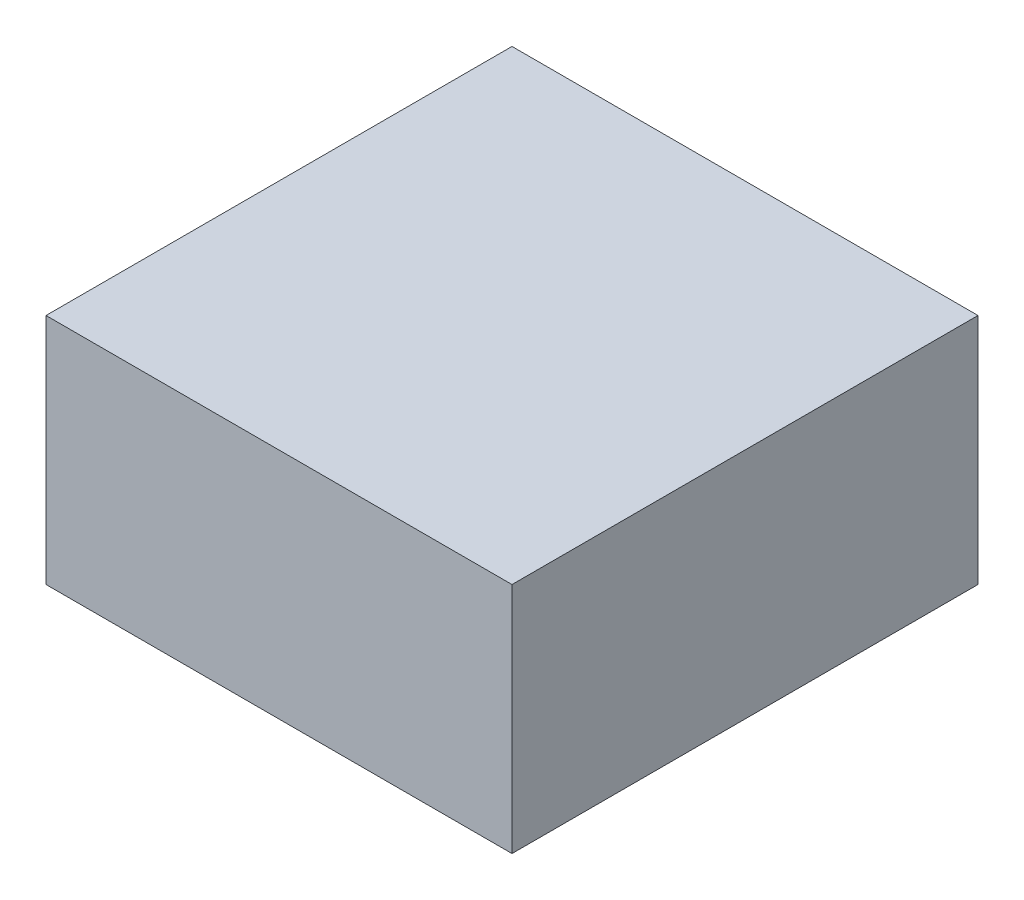
ISO-10303-21;
HEADER;
FILE_DESCRIPTION(('STEP AP214'),'2;1');
FILE_NAME('part.step','',(''),(''),'','','');
FILE_SCHEMA(('AUTOMOTIVE_DESIGN { 1 0 10303 214 1 1 1 1 }'));
ENDSEC;
DATA;
#1=APPLICATION_CONTEXT('core data for automotive mechanical design processes');
#2=APPLICATION_PROTOCOL_DEFINITION('international standard','automotive_design',2000,#1);
#3=PRODUCT_CONTEXT('',#1,'mechanical');
#4=PRODUCT('Part','Part','',(#3));
#5=PRODUCT_RELATED_PRODUCT_CATEGORY('part','',(#4));
#6=PRODUCT_DEFINITION_FORMATION('','',#4);
#7=PRODUCT_DEFINITION_CONTEXT('part definition',#1,'design');
#8=PRODUCT_DEFINITION('design','',#6,#7);
#9=PRODUCT_DEFINITION_SHAPE('','',#8);
#10=(LENGTH_UNIT() NAMED_UNIT(*) SI_UNIT(.MILLI.,.METRE.));
#11=(NAMED_UNIT(*) PLANE_ANGLE_UNIT() SI_UNIT($,.RADIAN.));
#12=(NAMED_UNIT(*) SI_UNIT($,.STERADIAN.) SOLID_ANGLE_UNIT());
#13=UNCERTAINTY_MEASURE_WITH_UNIT(LENGTH_MEASURE(1.E-05),#10,'distance_accuracy_value','');
#14=(GEOMETRIC_REPRESENTATION_CONTEXT(3) GLOBAL_UNCERTAINTY_ASSIGNED_CONTEXT((#13)) GLOBAL_UNIT_ASSIGNED_CONTEXT((#10,
#11,#12)) REPRESENTATION_CONTEXT('',''));
#15=CARTESIAN_POINT('',(0.,0.,0.));
#16=DIRECTION('',(0.,0.,1.));
#17=DIRECTION('',(1.,0.,0.));
#18=AXIS2_PLACEMENT_3D('',#15,#16,#17);
#19=CARTESIAN_POINT('',(1500.,750.,1500.));
#20=DIRECTION('',(-1.,0.,0.));
#21=DIRECTION('',(0.,0.,1.));
#22=AXIS2_PLACEMENT_3D('',#19,#20,#21);
#23=PLANE('',#22);
#24=DIRECTION('',(0.,0.,-1.));
#25=VECTOR('',#24,1.);
#26=CARTESIAN_POINT('',(1500.,-750.,1500.));
#27=LINE('',#26,#25);
#28=CARTESIAN_POINT('',(1500.,-750.,1500.));
#29=VERTEX_POINT('',#28);
#30=CARTESIAN_POINT('',(1500.,-750.,-1500.));
#31=VERTEX_POINT('',#30);
#32=EDGE_CURVE('E107',#29,#31,#27,.T.);
#33=ORIENTED_EDGE('',*,*,#32,.T.);
#34=DIRECTION('',(0.,-1.,0.));
#35=VECTOR('',#34,1.);
#36=CARTESIAN_POINT('',(1500.,750.,-1500.));
#37=LINE('',#36,#35);
#38=CARTESIAN_POINT('',(1500.,750.,-1500.));
#39=VERTEX_POINT('',#38);
#40=EDGE_CURVE('E11',#39,#31,#37,.T.);
#41=ORIENTED_EDGE('',*,*,#40,.F.);
#42=DIRECTION('',(0.,0.,-1.));
#43=VECTOR('',#42,1.);
#44=CARTESIAN_POINT('',(1500.,750.,1500.));
#45=LINE('',#44,#43);
#46=CARTESIAN_POINT('',(1500.,750.,1500.));
#47=VERTEX_POINT('',#46);
#48=EDGE_CURVE('E91',#47,#39,#45,.T.);
#49=ORIENTED_EDGE('',*,*,#48,.F.);
#50=DIRECTION('',(0.,-1.,0.));
#51=VECTOR('',#50,1.);
#52=CARTESIAN_POINT('',(1500.,750.,1500.));
#53=LINE('',#52,#51);
#54=EDGE_CURVE('E103',#47,#29,#53,.T.);
#55=ORIENTED_EDGE('',*,*,#54,.T.);
#56=EDGE_LOOP('',(#33,#41,#49,#55));
#57=FACE_BOUND('',#56,.T.);
#58=ADVANCED_FACE('F39',(#57),#23,.F.);
#59=CARTESIAN_POINT('',(-1500.,750.,-1500.));
#60=DIRECTION('',(0.,0.,1.));
#61=DIRECTION('',(1.,0.,0.));
#62=AXIS2_PLACEMENT_3D('',#59,#60,#61);
#63=PLANE('',#62);
#64=DIRECTION('',(-1.,0.,0.));
#65=VECTOR('',#64,1.);
#66=CARTESIAN_POINT('',(-1500.,-750.,-1500.));
#67=LINE('',#66,#65);
#68=CARTESIAN_POINT('',(-1500.,-750.,-1500.));
#69=VERTEX_POINT('',#68);
#70=EDGE_CURVE('E96',#31,#69,#67,.T.);
#71=ORIENTED_EDGE('',*,*,#70,.T.);
#72=DIRECTION('',(0.,-1.,0.));
#73=VECTOR('',#72,1.);
#74=CARTESIAN_POINT('',(-1500.,750.,-1500.));
#75=LINE('',#74,#73);
#76=CARTESIAN_POINT('',(-1500.,750.,-1500.));
#77=VERTEX_POINT('',#76);
#78=EDGE_CURVE('E48',#77,#69,#75,.T.);
#79=ORIENTED_EDGE('',*,*,#78,.F.);
#80=DIRECTION('',(-1.,0.,0.));
#81=VECTOR('',#80,1.);
#82=CARTESIAN_POINT('',(-1500.,750.,-1500.));
#83=LINE('',#82,#81);
#84=EDGE_CURVE('E86',#39,#77,#83,.T.);
#85=ORIENTED_EDGE('',*,*,#84,.F.);
#86=ORIENTED_EDGE('',*,*,#40,.T.);
#87=EDGE_LOOP('',(#71,#79,#85,#86));
#88=FACE_BOUND('',#87,.T.);
#89=ADVANCED_FACE('F95',(#88),#63,.F.);
#90=CARTESIAN_POINT('',(-1500.,750.,1500.));
#91=DIRECTION('',(1.,0.,0.));
#92=DIRECTION('',(0.,0.,-1.));
#93=AXIS2_PLACEMENT_3D('',#90,#91,#92);
#94=PLANE('',#93);
#95=DIRECTION('',(0.,0.,1.));
#96=VECTOR('',#95,1.);
#97=CARTESIAN_POINT('',(-1500.,-750.,1500.));
#98=LINE('',#97,#96);
#99=CARTESIAN_POINT('',(-1500.,-750.,1500.));
#100=VERTEX_POINT('',#99);
#101=EDGE_CURVE('E73',#69,#100,#98,.T.);
#102=ORIENTED_EDGE('',*,*,#101,.T.);
#103=DIRECTION('',(0.,-1.,0.));
#104=VECTOR('',#103,1.);
#105=CARTESIAN_POINT('',(-1500.,750.,1500.));
#106=LINE('',#105,#104);
#107=CARTESIAN_POINT('',(-1500.,750.,1500.));
#108=VERTEX_POINT('',#107);
#109=EDGE_CURVE('E98',#108,#100,#106,.T.);
#110=ORIENTED_EDGE('',*,*,#109,.F.);
#111=DIRECTION('',(0.,0.,1.));
#112=VECTOR('',#111,1.);
#113=CARTESIAN_POINT('',(-1500.,750.,1500.));
#114=LINE('',#113,#112);
#115=EDGE_CURVE('E89',#77,#108,#114,.T.);
#116=ORIENTED_EDGE('',*,*,#115,.F.);
#117=ORIENTED_EDGE('',*,*,#78,.T.);
#118=EDGE_LOOP('',(#102,#110,#116,#117));
#119=FACE_BOUND('',#118,.T.);
#120=ADVANCED_FACE('F99',(#119),#94,.F.);
#121=CARTESIAN_POINT('',(-1500.,750.,1500.));
#122=DIRECTION('',(0.,0.,-1.));
#123=DIRECTION('',(-1.,0.,0.));
#124=AXIS2_PLACEMENT_3D('',#121,#122,#123);
#125=PLANE('',#124);
#126=DIRECTION('',(1.,0.,0.));
#127=VECTOR('',#126,1.);
#128=CARTESIAN_POINT('',(-1500.,-750.,1500.));
#129=LINE('',#128,#127);
#130=EDGE_CURVE('E79',#100,#29,#129,.T.);
#131=ORIENTED_EDGE('',*,*,#130,.T.);
#132=ORIENTED_EDGE('',*,*,#54,.F.);
#133=DIRECTION('',(1.,0.,0.));
#134=VECTOR('',#133,1.);
#135=CARTESIAN_POINT('',(-1500.,750.,1500.));
#136=LINE('',#135,#134);
#137=EDGE_CURVE('E56',#108,#47,#136,.T.);
#138=ORIENTED_EDGE('',*,*,#137,.F.);
#139=ORIENTED_EDGE('',*,*,#109,.T.);
#140=EDGE_LOOP('',(#131,#132,#138,#139));
#141=FACE_BOUND('',#140,.T.);
#142=ADVANCED_FACE('F120',(#141),#125,.F.);
#143=CARTESIAN_POINT('',(0.,750.,0.));
#144=DIRECTION('',(0.,-1.,0.));
#145=DIRECTION('',(0.,0.,-1.));
#146=AXIS2_PLACEMENT_3D('',#143,#144,#145);
#147=PLANE('',#146);
#148=ORIENTED_EDGE('',*,*,#48,.T.);
#149=ORIENTED_EDGE('',*,*,#84,.T.);
#150=ORIENTED_EDGE('',*,*,#115,.T.);
#151=ORIENTED_EDGE('',*,*,#137,.T.);
#152=EDGE_LOOP('',(#148,#149,#150,#151));
#153=FACE_BOUND('',#152,.T.);
#154=ADVANCED_FACE('F87',(#153),#147,.F.);
#155=CARTESIAN_POINT('',(0.,-750.,0.));
#156=DIRECTION('',(0.,-1.,0.));
#157=DIRECTION('',(0.,0.,-1.));
#158=AXIS2_PLACEMENT_3D('',#155,#156,#157);
#159=PLANE('',#158);
#160=ORIENTED_EDGE('',*,*,#32,.F.);
#161=ORIENTED_EDGE('',*,*,#130,.F.);
#162=ORIENTED_EDGE('',*,*,#101,.F.);
#163=ORIENTED_EDGE('',*,*,#70,.F.);
#164=EDGE_LOOP('',(#160,#161,#162,#163));
#165=FACE_BOUND('',#164,.T.);
#166=ADVANCED_FACE('F123',(#165),#159,.T.);
#167=CLOSED_SHELL('',(#58,#89,#120,#142,#154,#166));
#168=MANIFOLD_SOLID_BREP('B2',#167);
#169=ADVANCED_BREP_SHAPE_REPRESENTATION('',(#18,#168),#14);
#170=SHAPE_DEFINITION_REPRESENTATION(#9,#169);
ENDSEC;
END-ISO-10303-21;
